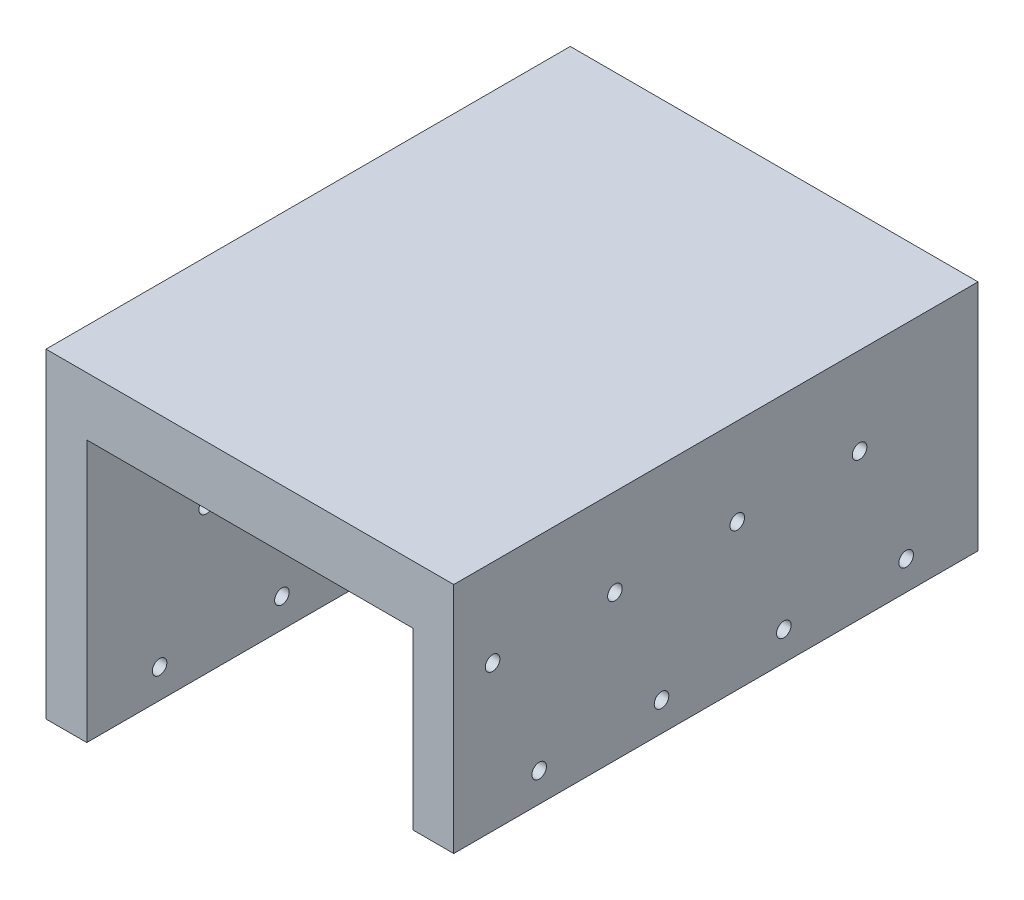
ISO-10303-21;
HEADER;
FILE_DESCRIPTION(('STEP AP214'),'2;1');
FILE_NAME('part.step','',(''),(''),'','','');
FILE_SCHEMA(('AUTOMOTIVE_DESIGN { 1 0 10303 214 1 1 1 1 }'));
ENDSEC;
DATA;
#1=APPLICATION_CONTEXT('core data for automotive mechanical design processes');
#2=APPLICATION_PROTOCOL_DEFINITION('international standard','automotive_design',2000,#1);
#3=PRODUCT_CONTEXT('',#1,'mechanical');
#4=PRODUCT('Part','Part','',(#3));
#5=PRODUCT_RELATED_PRODUCT_CATEGORY('part','',(#4));
#6=PRODUCT_DEFINITION_FORMATION('','',#4);
#7=PRODUCT_DEFINITION_CONTEXT('part definition',#1,'design');
#8=PRODUCT_DEFINITION('design','',#6,#7);
#9=PRODUCT_DEFINITION_SHAPE('','',#8);
#10=(LENGTH_UNIT() NAMED_UNIT(*) SI_UNIT(.MILLI.,.METRE.));
#11=(NAMED_UNIT(*) PLANE_ANGLE_UNIT() SI_UNIT($,.RADIAN.));
#12=(NAMED_UNIT(*) SI_UNIT($,.STERADIAN.) SOLID_ANGLE_UNIT());
#13=UNCERTAINTY_MEASURE_WITH_UNIT(LENGTH_MEASURE(1.E-05),#10,'distance_accuracy_value','');
#14=(GEOMETRIC_REPRESENTATION_CONTEXT(3) GLOBAL_UNCERTAINTY_ASSIGNED_CONTEXT((#13)) GLOBAL_UNIT_ASSIGNED_CONTEXT((#10,
#11,#12)) REPRESENTATION_CONTEXT('',''));
#15=CARTESIAN_POINT('',(0.,0.,0.));
#16=DIRECTION('',(0.,0.,1.));
#17=DIRECTION('',(1.,0.,0.));
#18=AXIS2_PLACEMENT_3D('',#15,#16,#17);
#19=CARTESIAN_POINT('',(0.,0.,90.));
#20=DIRECTION('',(1.,0.,0.));
#21=DIRECTION('',(0.,1.,0.));
#22=AXIS2_PLACEMENT_3D('',#19,#20,#21);
#23=PLANE('',#22);
#24=CARTESIAN_POINT('',(0.,25.,6.50000000000001));
#25=DIRECTION('',(-1.,0.,0.));
#26=DIRECTION('',(0.,-1.,0.));
#27=AXIS2_PLACEMENT_3D('',#24,#25,#26);
#28=CIRCLE('',#27,1.25);
#29=CARTESIAN_POINT('',(0.,23.75,6.50000000000001));
#30=VERTEX_POINT('',#29);
#31=EDGE_CURVE('E269',#30,#30,#28,.T.);
#32=ORIENTED_EDGE('',*,*,#31,.F.);
#33=EDGE_LOOP('',(#32));
#34=FACE_BOUND('',#33,.T.);
#35=CARTESIAN_POINT('',(0.,5.,14.5));
#36=DIRECTION('',(-1.,0.,0.));
#37=DIRECTION('',(0.,-1.,0.));
#38=AXIS2_PLACEMENT_3D('',#35,#36,#37);
#39=CIRCLE('',#38,1.25);
#40=CARTESIAN_POINT('',(0.,3.75,14.5));
#41=VERTEX_POINT('',#40);
#42=EDGE_CURVE('E265',#41,#41,#39,.T.);
#43=ORIENTED_EDGE('',*,*,#42,.F.);
#44=EDGE_LOOP('',(#43));
#45=FACE_BOUND('',#44,.T.);
#46=CARTESIAN_POINT('',(0.,25.,27.5));
#47=DIRECTION('',(-1.,0.,0.));
#48=DIRECTION('',(0.,-1.,0.));
#49=AXIS2_PLACEMENT_3D('',#46,#47,#48);
#50=CIRCLE('',#49,1.25);
#51=CARTESIAN_POINT('',(0.,23.75,27.5));
#52=VERTEX_POINT('',#51);
#53=EDGE_CURVE('E257',#52,#52,#50,.T.);
#54=ORIENTED_EDGE('',*,*,#53,.F.);
#55=EDGE_LOOP('',(#54));
#56=FACE_BOUND('',#55,.T.);
#57=CARTESIAN_POINT('',(0.,5.,35.5));
#58=DIRECTION('',(-1.,0.,0.));
#59=DIRECTION('',(0.,-1.,0.));
#60=AXIS2_PLACEMENT_3D('',#57,#58,#59);
#61=CIRCLE('',#60,1.25000000000001);
#62=CARTESIAN_POINT('',(0.,3.74999999999999,35.5));
#63=VERTEX_POINT('',#62);
#64=EDGE_CURVE('E249',#63,#63,#61,.T.);
#65=ORIENTED_EDGE('',*,*,#64,.F.);
#66=EDGE_LOOP('',(#65));
#67=FACE_BOUND('',#66,.T.);
#68=CARTESIAN_POINT('',(0.,25.,48.5));
#69=DIRECTION('',(-1.,0.,0.));
#70=DIRECTION('',(0.,-1.,0.));
#71=AXIS2_PLACEMENT_3D('',#68,#69,#70);
#72=CIRCLE('',#71,1.25);
#73=CARTESIAN_POINT('',(0.,23.75,48.5));
#74=VERTEX_POINT('',#73);
#75=EDGE_CURVE('E241',#74,#74,#72,.T.);
#76=ORIENTED_EDGE('',*,*,#75,.F.);
#77=EDGE_LOOP('',(#76));
#78=FACE_BOUND('',#77,.T.);
#79=CARTESIAN_POINT('',(0.,5.,56.5));
#80=DIRECTION('',(-1.,0.,0.));
#81=DIRECTION('',(0.,-1.,0.));
#82=AXIS2_PLACEMENT_3D('',#79,#80,#81);
#83=CIRCLE('',#82,1.25000000000001);
#84=CARTESIAN_POINT('',(0.,3.74999999999999,56.5));
#85=VERTEX_POINT('',#84);
#86=EDGE_CURVE('E233',#85,#85,#83,.T.);
#87=ORIENTED_EDGE('',*,*,#86,.F.);
#88=EDGE_LOOP('',(#87));
#89=FACE_BOUND('',#88,.T.);
#90=CARTESIAN_POINT('',(0.,25.,69.5));
#91=DIRECTION('',(-1.,0.,0.));
#92=DIRECTION('',(0.,-1.,0.));
#93=AXIS2_PLACEMENT_3D('',#90,#91,#92);
#94=CIRCLE('',#93,1.25);
#95=CARTESIAN_POINT('',(0.,23.75,69.5));
#96=VERTEX_POINT('',#95);
#97=EDGE_CURVE('E225',#96,#96,#94,.T.);
#98=ORIENTED_EDGE('',*,*,#97,.F.);
#99=EDGE_LOOP('',(#98));
#100=FACE_BOUND('',#99,.T.);
#101=CARTESIAN_POINT('',(0.,5.,77.5));
#102=DIRECTION('',(-1.,0.,0.));
#103=DIRECTION('',(0.,-1.,0.));
#104=AXIS2_PLACEMENT_3D('',#101,#102,#103);
#105=CIRCLE('',#104,1.25000000000001);
#106=CARTESIAN_POINT('',(0.,3.74999999999999,77.5));
#107=VERTEX_POINT('',#106);
#108=EDGE_CURVE('E215',#107,#107,#105,.T.);
#109=ORIENTED_EDGE('',*,*,#108,.F.);
#110=EDGE_LOOP('',(#109));
#111=FACE_BOUND('',#110,.T.);
#112=DIRECTION('',(0.,-1.,0.));
#113=VECTOR('',#112,1.);
#114=CARTESIAN_POINT('',(0.,0.,0.));
#115=LINE('',#114,#113);
#116=CARTESIAN_POINT('',(0.,55.,0.));
#117=VERTEX_POINT('',#116);
#118=CARTESIAN_POINT('',(0.,0.,0.));
#119=VERTEX_POINT('',#118);
#120=EDGE_CURVE('E149',#117,#119,#115,.T.);
#121=ORIENTED_EDGE('',*,*,#120,.T.);
#122=DIRECTION('',(0.,0.,-1.));
#123=VECTOR('',#122,1.);
#124=CARTESIAN_POINT('',(0.,0.,90.));
#125=LINE('',#124,#123);
#126=CARTESIAN_POINT('',(0.,0.,90.));
#127=VERTEX_POINT('',#126);
#128=EDGE_CURVE('E11',#127,#119,#125,.T.);
#129=ORIENTED_EDGE('',*,*,#128,.F.);
#130=DIRECTION('',(0.,-1.,0.));
#131=VECTOR('',#130,1.);
#132=CARTESIAN_POINT('',(0.,0.,90.));
#133=LINE('',#132,#131);
#134=CARTESIAN_POINT('',(0.,55.,90.));
#135=VERTEX_POINT('',#134);
#136=EDGE_CURVE('E146',#135,#127,#133,.T.);
#137=ORIENTED_EDGE('',*,*,#136,.F.);
#138=DIRECTION('',(0.,0.,-1.));
#139=VECTOR('',#138,1.);
#140=CARTESIAN_POINT('',(0.,55.,90.));
#141=LINE('',#140,#139);
#142=EDGE_CURVE('E153',#135,#117,#141,.T.);
#143=ORIENTED_EDGE('',*,*,#142,.T.);
#144=EDGE_LOOP('',(#121,#129,#137,#143));
#145=FACE_BOUND('',#144,.T.);
#146=ADVANCED_FACE('F43',(#34,#45,#56,#67,#78,#89,#100,#111,#145),#23,.F.);
#147=CARTESIAN_POINT('',(0.,0.,90.));
#148=DIRECTION('',(0.,1.,0.));
#149=DIRECTION('',(0.,0.,1.));
#150=AXIS2_PLACEMENT_3D('',#147,#148,#149);
#151=PLANE('',#150);
#152=DIRECTION('',(1.,0.,0.));
#153=VECTOR('',#152,1.);
#154=CARTESIAN_POINT('',(0.,0.,0.));
#155=LINE('',#154,#153);
#156=CARTESIAN_POINT('',(6.99999999999997,0.,0.));
#157=VERTEX_POINT('',#156);
#158=EDGE_CURVE('E142',#119,#157,#155,.T.);
#159=ORIENTED_EDGE('',*,*,#158,.T.);
#160=DIRECTION('',(0.,0.,1.));
#161=VECTOR('',#160,1.);
#162=CARTESIAN_POINT('',(6.99999999999997,0.,0.));
#163=LINE('',#162,#161);
#164=CARTESIAN_POINT('',(6.99999999999997,0.,90.));
#165=VERTEX_POINT('',#164);
#166=EDGE_CURVE('E182',#157,#165,#163,.T.);
#167=ORIENTED_EDGE('',*,*,#166,.T.);
#168=DIRECTION('',(1.,0.,0.));
#169=VECTOR('',#168,1.);
#170=CARTESIAN_POINT('',(0.,0.,90.));
#171=LINE('',#170,#169);
#172=EDGE_CURVE('E90',#127,#165,#171,.T.);
#173=ORIENTED_EDGE('',*,*,#172,.F.);
#174=ORIENTED_EDGE('',*,*,#128,.T.);
#175=EDGE_LOOP('',(#159,#167,#173,#174));
#176=FACE_BOUND('',#175,.T.);
#177=ADVANCED_FACE('F181',(#176),#151,.F.);
#178=CARTESIAN_POINT('',(70.,0.,90.));
#179=DIRECTION('',(-1.,0.,0.));
#180=DIRECTION('',(0.,-1.,0.));
#181=AXIS2_PLACEMENT_3D('',#178,#179,#180);
#182=PLANE('',#181);
#183=CARTESIAN_POINT('',(70.,40.,83.3317645611481));
#184=DIRECTION('',(1.,0.,0.));
#185=DIRECTION('',(0.,1.,0.));
#186=AXIS2_PLACEMENT_3D('',#183,#184,#185);
#187=CIRCLE('',#186,1.25);
#188=CARTESIAN_POINT('',(70.,41.25,83.3317645611481));
#189=VERTEX_POINT('',#188);
#190=EDGE_CURVE('E332',#189,#189,#187,.T.);
#191=ORIENTED_EDGE('',*,*,#190,.F.);
#192=EDGE_LOOP('',(#191));
#193=FACE_BOUND('',#192,.T.);
#194=CARTESIAN_POINT('',(70.,20.,75.3317645611481));
#195=DIRECTION('',(1.,0.,0.));
#196=DIRECTION('',(0.,1.,0.));
#197=AXIS2_PLACEMENT_3D('',#194,#195,#196);
#198=CIRCLE('',#197,1.25);
#199=CARTESIAN_POINT('',(70.,21.25,75.3317645611481));
#200=VERTEX_POINT('',#199);
#201=EDGE_CURVE('E328',#200,#200,#198,.T.);
#202=ORIENTED_EDGE('',*,*,#201,.F.);
#203=EDGE_LOOP('',(#202));
#204=FACE_BOUND('',#203,.T.);
#205=CARTESIAN_POINT('',(70.,40.,62.3317645611481));
#206=DIRECTION('',(1.,0.,0.));
#207=DIRECTION('',(0.,1.,0.));
#208=AXIS2_PLACEMENT_3D('',#205,#206,#207);
#209=CIRCLE('',#208,1.25);
#210=CARTESIAN_POINT('',(70.,41.25,62.3317645611481));
#211=VERTEX_POINT('',#210);
#212=EDGE_CURVE('E320',#211,#211,#209,.T.);
#213=ORIENTED_EDGE('',*,*,#212,.F.);
#214=EDGE_LOOP('',(#213));
#215=FACE_BOUND('',#214,.T.);
#216=CARTESIAN_POINT('',(70.,20.,54.3317645611481));
#217=DIRECTION('',(1.,0.,0.));
#218=DIRECTION('',(0.,1.,0.));
#219=AXIS2_PLACEMENT_3D('',#216,#217,#218);
#220=CIRCLE('',#219,1.25000000000001);
#221=CARTESIAN_POINT('',(70.,21.25,54.3317645611481));
#222=VERTEX_POINT('',#221);
#223=EDGE_CURVE('E312',#222,#222,#220,.T.);
#224=ORIENTED_EDGE('',*,*,#223,.F.);
#225=EDGE_LOOP('',(#224));
#226=FACE_BOUND('',#225,.T.);
#227=CARTESIAN_POINT('',(70.,40.,41.3317645611481));
#228=DIRECTION('',(1.,0.,0.));
#229=DIRECTION('',(0.,1.,0.));
#230=AXIS2_PLACEMENT_3D('',#227,#228,#229);
#231=CIRCLE('',#230,1.25);
#232=CARTESIAN_POINT('',(70.,41.25,41.3317645611481));
#233=VERTEX_POINT('',#232);
#234=EDGE_CURVE('E304',#233,#233,#231,.T.);
#235=ORIENTED_EDGE('',*,*,#234,.F.);
#236=EDGE_LOOP('',(#235));
#237=FACE_BOUND('',#236,.T.);
#238=CARTESIAN_POINT('',(70.,20.,33.3317645611481));
#239=DIRECTION('',(1.,0.,0.));
#240=DIRECTION('',(0.,1.,0.));
#241=AXIS2_PLACEMENT_3D('',#238,#239,#240);
#242=CIRCLE('',#241,1.25000000000001);
#243=CARTESIAN_POINT('',(70.,21.25,33.3317645611481));
#244=VERTEX_POINT('',#243);
#245=EDGE_CURVE('E296',#244,#244,#242,.T.);
#246=ORIENTED_EDGE('',*,*,#245,.F.);
#247=EDGE_LOOP('',(#246));
#248=FACE_BOUND('',#247,.T.);
#249=CARTESIAN_POINT('',(70.,40.,20.3317645611481));
#250=DIRECTION('',(1.,0.,0.));
#251=DIRECTION('',(0.,1.,0.));
#252=AXIS2_PLACEMENT_3D('',#249,#250,#251);
#253=CIRCLE('',#252,1.25);
#254=CARTESIAN_POINT('',(70.,41.25,20.3317645611481));
#255=VERTEX_POINT('',#254);
#256=EDGE_CURVE('E288',#255,#255,#253,.T.);
#257=ORIENTED_EDGE('',*,*,#256,.F.);
#258=EDGE_LOOP('',(#257));
#259=FACE_BOUND('',#258,.T.);
#260=CARTESIAN_POINT('',(70.,20.,12.3317645611481));
#261=DIRECTION('',(1.,0.,0.));
#262=DIRECTION('',(0.,1.,0.));
#263=AXIS2_PLACEMENT_3D('',#260,#261,#262);
#264=CIRCLE('',#263,1.25000000000001);
#265=CARTESIAN_POINT('',(70.,21.25,12.3317645611481));
#266=VERTEX_POINT('',#265);
#267=EDGE_CURVE('E279',#266,#266,#264,.T.);
#268=ORIENTED_EDGE('',*,*,#267,.F.);
#269=EDGE_LOOP('',(#268));
#270=FACE_BOUND('',#269,.T.);
#271=DIRECTION('',(0.,1.,0.));
#272=VECTOR('',#271,1.);
#273=CARTESIAN_POINT('',(70.,0.,90.));
#274=LINE('',#273,#272);
#275=CARTESIAN_POINT('',(70.,15.,90.));
#276=VERTEX_POINT('',#275);
#277=CARTESIAN_POINT('',(70.,55.,90.));
#278=VERTEX_POINT('',#277);
#279=EDGE_CURVE('E134',#276,#278,#274,.T.);
#280=ORIENTED_EDGE('',*,*,#279,.F.);
#281=DIRECTION('',(0.,0.,1.));
#282=VECTOR('',#281,1.);
#283=CARTESIAN_POINT('',(70.,15.,0.));
#284=LINE('',#283,#282);
#285=CARTESIAN_POINT('',(70.,15.,0.));
#286=VERTEX_POINT('',#285);
#287=EDGE_CURVE('E121',#286,#276,#284,.T.);
#288=ORIENTED_EDGE('',*,*,#287,.F.);
#289=DIRECTION('',(0.,1.,0.));
#290=VECTOR('',#289,1.);
#291=CARTESIAN_POINT('',(70.,0.,0.));
#292=LINE('',#291,#290);
#293=CARTESIAN_POINT('',(70.,55.,0.));
#294=VERTEX_POINT('',#293);
#295=EDGE_CURVE('E133',#286,#294,#292,.T.);
#296=ORIENTED_EDGE('',*,*,#295,.T.);
#297=DIRECTION('',(0.,0.,-1.));
#298=VECTOR('',#297,1.);
#299=CARTESIAN_POINT('',(70.,55.,90.));
#300=LINE('',#299,#298);
#301=EDGE_CURVE('E51',#278,#294,#300,.T.);
#302=ORIENTED_EDGE('',*,*,#301,.F.);
#303=EDGE_LOOP('',(#280,#288,#296,#302));
#304=FACE_BOUND('',#303,.T.);
#305=ADVANCED_FACE('F131',(#193,#204,#215,#226,#237,#248,#259,#270,#304),#182,.F.);
#306=CARTESIAN_POINT('',(0.,55.,90.));
#307=DIRECTION('',(0.,-1.,0.));
#308=DIRECTION('',(0.,0.,-1.));
#309=AXIS2_PLACEMENT_3D('',#306,#307,#308);
#310=PLANE('',#309);
#311=DIRECTION('',(-1.,0.,0.));
#312=VECTOR('',#311,1.);
#313=CARTESIAN_POINT('',(0.,55.,0.));
#314=LINE('',#313,#312);
#315=EDGE_CURVE('E84',#294,#117,#314,.T.);
#316=ORIENTED_EDGE('',*,*,#315,.T.);
#317=ORIENTED_EDGE('',*,*,#142,.F.);
#318=DIRECTION('',(-1.,0.,0.));
#319=VECTOR('',#318,1.);
#320=CARTESIAN_POINT('',(0.,55.,90.));
#321=LINE('',#320,#319);
#322=EDGE_CURVE('E67',#278,#135,#321,.T.);
#323=ORIENTED_EDGE('',*,*,#322,.F.);
#324=ORIENTED_EDGE('',*,*,#301,.T.);
#325=EDGE_LOOP('',(#316,#317,#323,#324));
#326=FACE_BOUND('',#325,.T.);
#327=ADVANCED_FACE('F156',(#326),#310,.F.);
#328=CARTESIAN_POINT('',(0.,0.,90.));
#329=DIRECTION('',(0.,0.,-1.));
#330=DIRECTION('',(-1.,0.,0.));
#331=AXIS2_PLACEMENT_3D('',#328,#329,#330);
#332=PLANE('',#331);
#333=ORIENTED_EDGE('',*,*,#172,.T.);
#334=DIRECTION('',(0.,1.,0.));
#335=VECTOR('',#334,1.);
#336=CARTESIAN_POINT('',(6.99999999999997,0.,90.));
#337=LINE('',#336,#335);
#338=CARTESIAN_POINT('',(6.99999999999997,45.,90.));
#339=VERTEX_POINT('',#338);
#340=EDGE_CURVE('E165',#165,#339,#337,.T.);
#341=ORIENTED_EDGE('',*,*,#340,.T.);
#342=DIRECTION('',(1.,0.,0.));
#343=VECTOR('',#342,1.);
#344=CARTESIAN_POINT('',(0.,45.,90.));
#345=LINE('',#344,#343);
#346=CARTESIAN_POINT('',(63.,45.,90.));
#347=VERTEX_POINT('',#346);
#348=EDGE_CURVE('E170',#339,#347,#345,.T.);
#349=ORIENTED_EDGE('',*,*,#348,.T.);
#350=DIRECTION('',(0.,-1.,0.));
#351=VECTOR('',#350,1.);
#352=CARTESIAN_POINT('',(63.,0.,90.));
#353=LINE('',#352,#351);
#354=CARTESIAN_POINT('',(63.,15.,90.));
#355=VERTEX_POINT('',#354);
#356=EDGE_CURVE('E174',#347,#355,#353,.T.);
#357=ORIENTED_EDGE('',*,*,#356,.T.);
#358=DIRECTION('',(1.,0.,0.));
#359=VECTOR('',#358,1.);
#360=CARTESIAN_POINT('',(0.,15.,90.));
#361=LINE('',#360,#359);
#362=EDGE_CURVE('E197',#355,#276,#361,.T.);
#363=ORIENTED_EDGE('',*,*,#362,.T.);
#364=ORIENTED_EDGE('',*,*,#279,.T.);
#365=ORIENTED_EDGE('',*,*,#322,.T.);
#366=ORIENTED_EDGE('',*,*,#136,.T.);
#367=EDGE_LOOP('',(#333,#341,#349,#357,#363,#364,#365,#366));
#368=FACE_BOUND('',#367,.T.);
#369=ADVANCED_FACE('F180',(#368),#332,.F.);
#370=CARTESIAN_POINT('',(0.,0.,0.));
#371=DIRECTION('',(0.,0.,-1.));
#372=DIRECTION('',(-1.,0.,0.));
#373=AXIS2_PLACEMENT_3D('',#370,#371,#372);
#374=PLANE('',#373);
#375=DIRECTION('',(0.,-1.,0.));
#376=VECTOR('',#375,1.);
#377=CARTESIAN_POINT('',(6.99999999999997,0.,0.));
#378=LINE('',#377,#376);
#379=CARTESIAN_POINT('',(6.99999999999997,45.,0.));
#380=VERTEX_POINT('',#379);
#381=EDGE_CURVE('E136',#380,#157,#378,.T.);
#382=ORIENTED_EDGE('',*,*,#381,.T.);
#383=ORIENTED_EDGE('',*,*,#158,.F.);
#384=ORIENTED_EDGE('',*,*,#120,.F.);
#385=ORIENTED_EDGE('',*,*,#315,.F.);
#386=ORIENTED_EDGE('',*,*,#295,.F.);
#387=DIRECTION('',(-1.,0.,0.));
#388=VECTOR('',#387,1.);
#389=CARTESIAN_POINT('',(63.,15.,0.));
#390=LINE('',#389,#388);
#391=CARTESIAN_POINT('',(63.,15.,0.));
#392=VERTEX_POINT('',#391);
#393=EDGE_CURVE('E118',#286,#392,#390,.T.);
#394=ORIENTED_EDGE('',*,*,#393,.T.);
#395=DIRECTION('',(0.,1.,0.));
#396=VECTOR('',#395,1.);
#397=CARTESIAN_POINT('',(63.,45.,0.));
#398=LINE('',#397,#396);
#399=CARTESIAN_POINT('',(63.,45.,0.));
#400=VERTEX_POINT('',#399);
#401=EDGE_CURVE('E58',#392,#400,#398,.T.);
#402=ORIENTED_EDGE('',*,*,#401,.T.);
#403=DIRECTION('',(-1.,0.,0.));
#404=VECTOR('',#403,1.);
#405=CARTESIAN_POINT('',(6.99999999999997,45.,0.));
#406=LINE('',#405,#404);
#407=EDGE_CURVE('E186',#400,#380,#406,.T.);
#408=ORIENTED_EDGE('',*,*,#407,.T.);
#409=EDGE_LOOP('',(#382,#383,#384,#385,#386,#394,#402,#408));
#410=FACE_BOUND('',#409,.T.);
#411=ADVANCED_FACE('F139',(#410),#374,.T.);
#412=CARTESIAN_POINT('',(6.99999999999997,0.,0.));
#413=DIRECTION('',(-1.,0.,0.));
#414=DIRECTION('',(0.,0.,1.));
#415=AXIS2_PLACEMENT_3D('',#412,#413,#414);
#416=PLANE('',#415);
#417=CARTESIAN_POINT('',(6.99999999999997,25.,6.50000000000001));
#418=DIRECTION('',(-1.,0.,0.));
#419=DIRECTION('',(0.,0.,1.));
#420=AXIS2_PLACEMENT_3D('',#417,#418,#419);
#421=CIRCLE('',#420,1.25);
#422=CARTESIAN_POINT('',(6.99999999999997,25.,7.75000000000001));
#423=VERTEX_POINT('',#422);
#424=EDGE_CURVE('E127',#423,#423,#421,.F.);
#425=ORIENTED_EDGE('',*,*,#424,.F.);
#426=EDGE_LOOP('',(#425));
#427=FACE_BOUND('',#426,.T.);
#428=CARTESIAN_POINT('',(6.99999999999997,5.,14.5));
#429=DIRECTION('',(-1.,0.,0.));
#430=DIRECTION('',(0.,0.,1.));
#431=AXIS2_PLACEMENT_3D('',#428,#429,#430);
#432=CIRCLE('',#431,1.25);
#433=CARTESIAN_POINT('',(6.99999999999997,5.,15.75));
#434=VERTEX_POINT('',#433);
#435=EDGE_CURVE('E261',#434,#434,#432,.F.);
#436=ORIENTED_EDGE('',*,*,#435,.F.);
#437=EDGE_LOOP('',(#436));
#438=FACE_BOUND('',#437,.T.);
#439=CARTESIAN_POINT('',(6.99999999999997,25.,27.5));
#440=DIRECTION('',(-1.,0.,0.));
#441=DIRECTION('',(0.,0.,1.));
#442=AXIS2_PLACEMENT_3D('',#439,#440,#441);
#443=CIRCLE('',#442,1.25);
#444=CARTESIAN_POINT('',(6.99999999999997,25.,28.75));
#445=VERTEX_POINT('',#444);
#446=EDGE_CURVE('E253',#445,#445,#443,.F.);
#447=ORIENTED_EDGE('',*,*,#446,.F.);
#448=EDGE_LOOP('',(#447));
#449=FACE_BOUND('',#448,.T.);
#450=CARTESIAN_POINT('',(6.99999999999997,5.,35.5));
#451=DIRECTION('',(-1.,0.,0.));
#452=DIRECTION('',(0.,0.,1.));
#453=AXIS2_PLACEMENT_3D('',#450,#451,#452);
#454=CIRCLE('',#453,1.25000000000001);
#455=CARTESIAN_POINT('',(6.99999999999997,5.,36.75));
#456=VERTEX_POINT('',#455);
#457=EDGE_CURVE('E245',#456,#456,#454,.F.);
#458=ORIENTED_EDGE('',*,*,#457,.F.);
#459=EDGE_LOOP('',(#458));
#460=FACE_BOUND('',#459,.T.);
#461=CARTESIAN_POINT('',(6.99999999999997,25.,48.5));
#462=DIRECTION('',(-1.,0.,0.));
#463=DIRECTION('',(0.,0.,1.));
#464=AXIS2_PLACEMENT_3D('',#461,#462,#463);
#465=CIRCLE('',#464,1.25);
#466=CARTESIAN_POINT('',(6.99999999999997,25.,49.75));
#467=VERTEX_POINT('',#466);
#468=EDGE_CURVE('E237',#467,#467,#465,.F.);
#469=ORIENTED_EDGE('',*,*,#468,.F.);
#470=EDGE_LOOP('',(#469));
#471=FACE_BOUND('',#470,.T.);
#472=CARTESIAN_POINT('',(6.99999999999997,5.,56.5));
#473=DIRECTION('',(-1.,0.,0.));
#474=DIRECTION('',(0.,0.,1.));
#475=AXIS2_PLACEMENT_3D('',#472,#473,#474);
#476=CIRCLE('',#475,1.25000000000001);
#477=CARTESIAN_POINT('',(6.99999999999997,5.,57.75));
#478=VERTEX_POINT('',#477);
#479=EDGE_CURVE('E229',#478,#478,#476,.F.);
#480=ORIENTED_EDGE('',*,*,#479,.F.);
#481=EDGE_LOOP('',(#480));
#482=FACE_BOUND('',#481,.T.);
#483=CARTESIAN_POINT('',(6.99999999999997,25.,69.5));
#484=DIRECTION('',(-1.,0.,0.));
#485=DIRECTION('',(0.,0.,1.));
#486=AXIS2_PLACEMENT_3D('',#483,#484,#485);
#487=CIRCLE('',#486,1.25);
#488=CARTESIAN_POINT('',(6.99999999999997,25.,70.75));
#489=VERTEX_POINT('',#488);
#490=EDGE_CURVE('E219',#489,#489,#487,.F.);
#491=ORIENTED_EDGE('',*,*,#490,.F.);
#492=EDGE_LOOP('',(#491));
#493=FACE_BOUND('',#492,.T.);
#494=CARTESIAN_POINT('',(6.99999999999997,5.,77.5));
#495=DIRECTION('',(-1.,0.,0.));
#496=DIRECTION('',(0.,0.,1.));
#497=AXIS2_PLACEMENT_3D('',#494,#495,#496);
#498=CIRCLE('',#497,1.25000000000001);
#499=CARTESIAN_POINT('',(6.99999999999997,5.,78.75));
#500=VERTEX_POINT('',#499);
#501=EDGE_CURVE('E220',#500,#500,#498,.F.);
#502=ORIENTED_EDGE('',*,*,#501,.F.);
#503=EDGE_LOOP('',(#502));
#504=FACE_BOUND('',#503,.T.);
#505=ORIENTED_EDGE('',*,*,#166,.F.);
#506=ORIENTED_EDGE('',*,*,#381,.F.);
#507=DIRECTION('',(0.,0.,1.));
#508=VECTOR('',#507,1.);
#509=CARTESIAN_POINT('',(6.99999999999997,45.,0.));
#510=LINE('',#509,#508);
#511=EDGE_CURVE('E198',#380,#339,#510,.T.);
#512=ORIENTED_EDGE('',*,*,#511,.T.);
#513=ORIENTED_EDGE('',*,*,#340,.F.);
#514=EDGE_LOOP('',(#505,#506,#512,#513));
#515=FACE_BOUND('',#514,.T.);
#516=ADVANCED_FACE('F414',(#427,#438,#449,#460,#471,#482,#493,#504,#515),#416,.F.);
#517=CARTESIAN_POINT('',(6.99999999999997,45.,0.));
#518=DIRECTION('',(0.,1.,0.));
#519=DIRECTION('',(0.,0.,1.));
#520=AXIS2_PLACEMENT_3D('',#517,#518,#519);
#521=PLANE('',#520);
#522=ORIENTED_EDGE('',*,*,#511,.F.);
#523=ORIENTED_EDGE('',*,*,#407,.F.);
#524=DIRECTION('',(0.,0.,1.));
#525=VECTOR('',#524,1.);
#526=CARTESIAN_POINT('',(63.,45.,0.));
#527=LINE('',#526,#525);
#528=EDGE_CURVE('E201',#400,#347,#527,.T.);
#529=ORIENTED_EDGE('',*,*,#528,.T.);
#530=ORIENTED_EDGE('',*,*,#348,.F.);
#531=EDGE_LOOP('',(#522,#523,#529,#530));
#532=FACE_BOUND('',#531,.T.);
#533=ADVANCED_FACE('F212',(#532),#521,.F.);
#534=CARTESIAN_POINT('',(63.,45.,0.));
#535=DIRECTION('',(1.,0.,0.));
#536=DIRECTION('',(0.,0.,-1.));
#537=AXIS2_PLACEMENT_3D('',#534,#535,#536);
#538=PLANE('',#537);
#539=CARTESIAN_POINT('',(63.,40.,83.3317645611481));
#540=DIRECTION('',(1.,0.,0.));
#541=DIRECTION('',(0.,0.,-1.));
#542=AXIS2_PLACEMENT_3D('',#539,#540,#541);
#543=CIRCLE('',#542,1.25);
#544=CARTESIAN_POINT('',(63.,40.,82.0817645611481));
#545=VERTEX_POINT('',#544);
#546=EDGE_CURVE('E224',#545,#545,#543,.F.);
#547=ORIENTED_EDGE('',*,*,#546,.F.);
#548=EDGE_LOOP('',(#547));
#549=FACE_BOUND('',#548,.T.);
#550=CARTESIAN_POINT('',(63.,20.,75.3317645611481));
#551=DIRECTION('',(1.,0.,0.));
#552=DIRECTION('',(0.,0.,-1.));
#553=AXIS2_PLACEMENT_3D('',#550,#551,#552);
#554=CIRCLE('',#553,1.25);
#555=CARTESIAN_POINT('',(63.,20.,74.0817645611481));
#556=VERTEX_POINT('',#555);
#557=EDGE_CURVE('E324',#556,#556,#554,.F.);
#558=ORIENTED_EDGE('',*,*,#557,.F.);
#559=EDGE_LOOP('',(#558));
#560=FACE_BOUND('',#559,.T.);
#561=CARTESIAN_POINT('',(63.,40.,62.3317645611481));
#562=DIRECTION('',(1.,0.,0.));
#563=DIRECTION('',(0.,0.,-1.));
#564=AXIS2_PLACEMENT_3D('',#561,#562,#563);
#565=CIRCLE('',#564,1.25);
#566=CARTESIAN_POINT('',(63.,40.,61.0817645611481));
#567=VERTEX_POINT('',#566);
#568=EDGE_CURVE('E316',#567,#567,#565,.F.);
#569=ORIENTED_EDGE('',*,*,#568,.F.);
#570=EDGE_LOOP('',(#569));
#571=FACE_BOUND('',#570,.T.);
#572=CARTESIAN_POINT('',(63.,20.,54.3317645611481));
#573=DIRECTION('',(1.,0.,0.));
#574=DIRECTION('',(0.,0.,-1.));
#575=AXIS2_PLACEMENT_3D('',#572,#573,#574);
#576=CIRCLE('',#575,1.25000000000001);
#577=CARTESIAN_POINT('',(63.,20.,53.0817645611481));
#578=VERTEX_POINT('',#577);
#579=EDGE_CURVE('E308',#578,#578,#576,.F.);
#580=ORIENTED_EDGE('',*,*,#579,.F.);
#581=EDGE_LOOP('',(#580));
#582=FACE_BOUND('',#581,.T.);
#583=CARTESIAN_POINT('',(63.,40.,41.3317645611481));
#584=DIRECTION('',(1.,0.,0.));
#585=DIRECTION('',(0.,0.,-1.));
#586=AXIS2_PLACEMENT_3D('',#583,#584,#585);
#587=CIRCLE('',#586,1.25);
#588=CARTESIAN_POINT('',(63.,40.,40.0817645611481));
#589=VERTEX_POINT('',#588);
#590=EDGE_CURVE('E300',#589,#589,#587,.F.);
#591=ORIENTED_EDGE('',*,*,#590,.F.);
#592=EDGE_LOOP('',(#591));
#593=FACE_BOUND('',#592,.T.);
#594=CARTESIAN_POINT('',(63.,20.,33.3317645611481));
#595=DIRECTION('',(1.,0.,0.));
#596=DIRECTION('',(0.,0.,-1.));
#597=AXIS2_PLACEMENT_3D('',#594,#595,#596);
#598=CIRCLE('',#597,1.25000000000001);
#599=CARTESIAN_POINT('',(63.,20.,32.0817645611481));
#600=VERTEX_POINT('',#599);
#601=EDGE_CURVE('E292',#600,#600,#598,.F.);
#602=ORIENTED_EDGE('',*,*,#601,.F.);
#603=EDGE_LOOP('',(#602));
#604=FACE_BOUND('',#603,.T.);
#605=CARTESIAN_POINT('',(63.,40.,20.3317645611481));
#606=DIRECTION('',(1.,0.,0.));
#607=DIRECTION('',(0.,0.,-1.));
#608=AXIS2_PLACEMENT_3D('',#605,#606,#607);
#609=CIRCLE('',#608,1.25);
#610=CARTESIAN_POINT('',(63.,40.,19.0817645611481));
#611=VERTEX_POINT('',#610);
#612=EDGE_CURVE('E283',#611,#611,#609,.F.);
#613=ORIENTED_EDGE('',*,*,#612,.F.);
#614=EDGE_LOOP('',(#613));
#615=FACE_BOUND('',#614,.T.);
#616=CARTESIAN_POINT('',(63.,20.,12.3317645611481));
#617=DIRECTION('',(1.,0.,0.));
#618=DIRECTION('',(0.,0.,-1.));
#619=AXIS2_PLACEMENT_3D('',#616,#617,#618);
#620=CIRCLE('',#619,1.25000000000001);
#621=CARTESIAN_POINT('',(63.,20.,11.0817645611481));
#622=VERTEX_POINT('',#621);
#623=EDGE_CURVE('E284',#622,#622,#620,.F.);
#624=ORIENTED_EDGE('',*,*,#623,.F.);
#625=EDGE_LOOP('',(#624));
#626=FACE_BOUND('',#625,.T.);
#627=ORIENTED_EDGE('',*,*,#528,.F.);
#628=ORIENTED_EDGE('',*,*,#401,.F.);
#629=DIRECTION('',(0.,0.,1.));
#630=VECTOR('',#629,1.);
#631=CARTESIAN_POINT('',(63.,15.,0.));
#632=LINE('',#631,#630);
#633=EDGE_CURVE('E123',#392,#355,#632,.T.);
#634=ORIENTED_EDGE('',*,*,#633,.T.);
#635=ORIENTED_EDGE('',*,*,#356,.F.);
#636=EDGE_LOOP('',(#627,#628,#634,#635));
#637=FACE_BOUND('',#636,.T.);
#638=ADVANCED_FACE('F210',(#549,#560,#571,#582,#593,#604,#615,#626,#637),#538,.F.);
#639=CARTESIAN_POINT('',(63.,15.,0.));
#640=DIRECTION('',(0.,1.,0.));
#641=DIRECTION('',(0.,0.,1.));
#642=AXIS2_PLACEMENT_3D('',#639,#640,#641);
#643=PLANE('',#642);
#644=ORIENTED_EDGE('',*,*,#633,.F.);
#645=ORIENTED_EDGE('',*,*,#393,.F.);
#646=ORIENTED_EDGE('',*,*,#287,.T.);
#647=ORIENTED_EDGE('',*,*,#362,.F.);
#648=EDGE_LOOP('',(#644,#645,#646,#647));
#649=FACE_BOUND('',#648,.T.);
#650=ADVANCED_FACE('F120',(#649),#643,.F.);
#651=CARTESIAN_POINT('',(10.5355339059327,5.00000000000001,77.5));
#652=DIRECTION('',(-1.,0.,0.));
#653=DIRECTION('',(0.,-1.,0.));
#654=AXIS2_PLACEMENT_3D('',#651,#652,#653);
#655=CYLINDRICAL_SURFACE('',#654,1.25000000000001);
#656=ORIENTED_EDGE('',*,*,#501,.T.);
#657=EDGE_LOOP('',(#656));
#658=FACE_BOUND('',#657,.T.);
#659=ORIENTED_EDGE('',*,*,#108,.T.);
#660=EDGE_LOOP('',(#659));
#661=FACE_BOUND('',#660,.T.);
#662=ADVANCED_FACE('F399',(#658,#661),#655,.F.);
#663=CARTESIAN_POINT('',(10.5355339059327,25.,69.5));
#664=DIRECTION('',(-1.,0.,0.));
#665=DIRECTION('',(0.,-1.,0.));
#666=AXIS2_PLACEMENT_3D('',#663,#664,#665);
#667=CYLINDRICAL_SURFACE('',#666,1.25);
#668=ORIENTED_EDGE('',*,*,#490,.T.);
#669=EDGE_LOOP('',(#668));
#670=FACE_BOUND('',#669,.T.);
#671=ORIENTED_EDGE('',*,*,#97,.T.);
#672=EDGE_LOOP('',(#671));
#673=FACE_BOUND('',#672,.T.);
#674=ADVANCED_FACE('F401',(#670,#673),#667,.F.);
#675=CARTESIAN_POINT('',(10.5355339059327,5.00000000000001,56.5));
#676=DIRECTION('',(-1.,0.,0.));
#677=DIRECTION('',(0.,-1.,0.));
#678=AXIS2_PLACEMENT_3D('',#675,#676,#677);
#679=CYLINDRICAL_SURFACE('',#678,1.25000000000001);
#680=ORIENTED_EDGE('',*,*,#479,.T.);
#681=EDGE_LOOP('',(#680));
#682=FACE_BOUND('',#681,.T.);
#683=ORIENTED_EDGE('',*,*,#86,.T.);
#684=EDGE_LOOP('',(#683));
#685=FACE_BOUND('',#684,.T.);
#686=ADVANCED_FACE('F408',(#682,#685),#679,.F.);
#687=CARTESIAN_POINT('',(10.5355339059327,25.,48.5));
#688=DIRECTION('',(-1.,0.,0.));
#689=DIRECTION('',(0.,-1.,0.));
#690=AXIS2_PLACEMENT_3D('',#687,#688,#689);
#691=CYLINDRICAL_SURFACE('',#690,1.25);
#692=ORIENTED_EDGE('',*,*,#468,.T.);
#693=EDGE_LOOP('',(#692));
#694=FACE_BOUND('',#693,.T.);
#695=ORIENTED_EDGE('',*,*,#75,.T.);
#696=EDGE_LOOP('',(#695));
#697=FACE_BOUND('',#696,.T.);
#698=ADVANCED_FACE('F522',(#694,#697),#691,.F.);
#699=CARTESIAN_POINT('',(10.5355339059327,5.00000000000001,35.5));
#700=DIRECTION('',(-1.,0.,0.));
#701=DIRECTION('',(0.,-1.,0.));
#702=AXIS2_PLACEMENT_3D('',#699,#700,#701);
#703=CYLINDRICAL_SURFACE('',#702,1.25000000000001);
#704=ORIENTED_EDGE('',*,*,#457,.T.);
#705=EDGE_LOOP('',(#704));
#706=FACE_BOUND('',#705,.T.);
#707=ORIENTED_EDGE('',*,*,#64,.T.);
#708=EDGE_LOOP('',(#707));
#709=FACE_BOUND('',#708,.T.);
#710=ADVANCED_FACE('F531',(#706,#709),#703,.F.);
#711=CARTESIAN_POINT('',(10.5355339059327,25.,27.5));
#712=DIRECTION('',(-1.,0.,0.));
#713=DIRECTION('',(0.,-1.,0.));
#714=AXIS2_PLACEMENT_3D('',#711,#712,#713);
#715=CYLINDRICAL_SURFACE('',#714,1.25);
#716=ORIENTED_EDGE('',*,*,#446,.T.);
#717=EDGE_LOOP('',(#716));
#718=FACE_BOUND('',#717,.T.);
#719=ORIENTED_EDGE('',*,*,#53,.T.);
#720=EDGE_LOOP('',(#719));
#721=FACE_BOUND('',#720,.T.);
#722=ADVANCED_FACE('F541',(#718,#721),#715,.F.);
#723=CARTESIAN_POINT('',(10.5355339059327,5.00000000000001,14.5));
#724=DIRECTION('',(-1.,0.,0.));
#725=DIRECTION('',(0.,-1.,0.));
#726=AXIS2_PLACEMENT_3D('',#723,#724,#725);
#727=CYLINDRICAL_SURFACE('',#726,1.25);
#728=ORIENTED_EDGE('',*,*,#435,.T.);
#729=EDGE_LOOP('',(#728));
#730=FACE_BOUND('',#729,.T.);
#731=ORIENTED_EDGE('',*,*,#42,.T.);
#732=EDGE_LOOP('',(#731));
#733=FACE_BOUND('',#732,.T.);
#734=ADVANCED_FACE('F375',(#730,#733),#727,.F.);
#735=CARTESIAN_POINT('',(10.5355339059327,25.,6.50000000000001));
#736=DIRECTION('',(-1.,0.,0.));
#737=DIRECTION('',(0.,-1.,0.));
#738=AXIS2_PLACEMENT_3D('',#735,#736,#737);
#739=CYLINDRICAL_SURFACE('',#738,1.25);
#740=ORIENTED_EDGE('',*,*,#424,.T.);
#741=EDGE_LOOP('',(#740));
#742=FACE_BOUND('',#741,.T.);
#743=ORIENTED_EDGE('',*,*,#31,.T.);
#744=EDGE_LOOP('',(#743));
#745=FACE_BOUND('',#744,.T.);
#746=ADVANCED_FACE('F365',(#742,#745),#739,.F.);
#747=CARTESIAN_POINT('',(59.4644660940672,20.,12.3317645611481));
#748=DIRECTION('',(1.,0.,0.));
#749=DIRECTION('',(0.,1.,0.));
#750=AXIS2_PLACEMENT_3D('',#747,#748,#749);
#751=CYLINDRICAL_SURFACE('',#750,1.25000000000001);
#752=ORIENTED_EDGE('',*,*,#623,.T.);
#753=EDGE_LOOP('',(#752));
#754=FACE_BOUND('',#753,.T.);
#755=ORIENTED_EDGE('',*,*,#267,.T.);
#756=EDGE_LOOP('',(#755));
#757=FACE_BOUND('',#756,.T.);
#758=ADVANCED_FACE('F362',(#754,#757),#751,.F.);
#759=CARTESIAN_POINT('',(59.4644660940672,40.,20.3317645611481));
#760=DIRECTION('',(1.,0.,0.));
#761=DIRECTION('',(0.,1.,0.));
#762=AXIS2_PLACEMENT_3D('',#759,#760,#761);
#763=CYLINDRICAL_SURFACE('',#762,1.25);
#764=ORIENTED_EDGE('',*,*,#612,.T.);
#765=EDGE_LOOP('',(#764));
#766=FACE_BOUND('',#765,.T.);
#767=ORIENTED_EDGE('',*,*,#256,.T.);
#768=EDGE_LOOP('',(#767));
#769=FACE_BOUND('',#768,.T.);
#770=ADVANCED_FACE('F364',(#766,#769),#763,.F.);
#771=CARTESIAN_POINT('',(59.4644660940672,20.,33.3317645611481));
#772=DIRECTION('',(1.,0.,0.));
#773=DIRECTION('',(0.,1.,0.));
#774=AXIS2_PLACEMENT_3D('',#771,#772,#773);
#775=CYLINDRICAL_SURFACE('',#774,1.25000000000001);
#776=ORIENTED_EDGE('',*,*,#601,.T.);
#777=EDGE_LOOP('',(#776));
#778=FACE_BOUND('',#777,.T.);
#779=ORIENTED_EDGE('',*,*,#245,.T.);
#780=EDGE_LOOP('',(#779));
#781=FACE_BOUND('',#780,.T.);
#782=ADVANCED_FACE('F372',(#778,#781),#775,.F.);
#783=CARTESIAN_POINT('',(59.4644660940672,40.,41.3317645611481));
#784=DIRECTION('',(1.,0.,0.));
#785=DIRECTION('',(0.,1.,0.));
#786=AXIS2_PLACEMENT_3D('',#783,#784,#785);
#787=CYLINDRICAL_SURFACE('',#786,1.25);
#788=ORIENTED_EDGE('',*,*,#590,.T.);
#789=EDGE_LOOP('',(#788));
#790=FACE_BOUND('',#789,.T.);
#791=ORIENTED_EDGE('',*,*,#234,.T.);
#792=EDGE_LOOP('',(#791));
#793=FACE_BOUND('',#792,.T.);
#794=ADVANCED_FACE('F585',(#790,#793),#787,.F.);
#795=CARTESIAN_POINT('',(59.4644660940672,20.,54.3317645611481));
#796=DIRECTION('',(1.,0.,0.));
#797=DIRECTION('',(0.,1.,0.));
#798=AXIS2_PLACEMENT_3D('',#795,#796,#797);
#799=CYLINDRICAL_SURFACE('',#798,1.25000000000001);
#800=ORIENTED_EDGE('',*,*,#579,.T.);
#801=EDGE_LOOP('',(#800));
#802=FACE_BOUND('',#801,.T.);
#803=ORIENTED_EDGE('',*,*,#223,.T.);
#804=EDGE_LOOP('',(#803));
#805=FACE_BOUND('',#804,.T.);
#806=ADVANCED_FACE('F595',(#802,#805),#799,.F.);
#807=CARTESIAN_POINT('',(59.4644660940672,40.,62.3317645611481));
#808=DIRECTION('',(1.,0.,0.));
#809=DIRECTION('',(0.,1.,0.));
#810=AXIS2_PLACEMENT_3D('',#807,#808,#809);
#811=CYLINDRICAL_SURFACE('',#810,1.25);
#812=ORIENTED_EDGE('',*,*,#568,.T.);
#813=EDGE_LOOP('',(#812));
#814=FACE_BOUND('',#813,.T.);
#815=ORIENTED_EDGE('',*,*,#212,.T.);
#816=EDGE_LOOP('',(#815));
#817=FACE_BOUND('',#816,.T.);
#818=ADVANCED_FACE('F605',(#814,#817),#811,.F.);
#819=CARTESIAN_POINT('',(59.4644660940672,20.,75.3317645611481));
#820=DIRECTION('',(1.,0.,0.));
#821=DIRECTION('',(0.,1.,0.));
#822=AXIS2_PLACEMENT_3D('',#819,#820,#821);
#823=CYLINDRICAL_SURFACE('',#822,1.25);
#824=ORIENTED_EDGE('',*,*,#557,.T.);
#825=EDGE_LOOP('',(#824));
#826=FACE_BOUND('',#825,.T.);
#827=ORIENTED_EDGE('',*,*,#201,.T.);
#828=EDGE_LOOP('',(#827));
#829=FACE_BOUND('',#828,.T.);
#830=ADVANCED_FACE('F615',(#826,#829),#823,.F.);
#831=CARTESIAN_POINT('',(59.4644660940672,40.,83.3317645611481));
#832=DIRECTION('',(1.,0.,0.));
#833=DIRECTION('',(0.,1.,0.));
#834=AXIS2_PLACEMENT_3D('',#831,#832,#833);
#835=CYLINDRICAL_SURFACE('',#834,1.25);
#836=ORIENTED_EDGE('',*,*,#546,.T.);
#837=EDGE_LOOP('',(#836));
#838=FACE_BOUND('',#837,.T.);
#839=ORIENTED_EDGE('',*,*,#190,.T.);
#840=EDGE_LOOP('',(#839));
#841=FACE_BOUND('',#840,.T.);
#842=ADVANCED_FACE('F343',(#838,#841),#835,.F.);
#843=CLOSED_SHELL('',(#146,#177,#305,#327,#369,#411,#516,#533,#638,#650,#662,#674,#686,#698,
#710,#722,#734,#746,#758,#770,#782,#794,#806,#818,#830,#842));
#844=MANIFOLD_SOLID_BREP('B2',#843);
#845=ADVANCED_BREP_SHAPE_REPRESENTATION('',(#18,#844),#14);
#846=SHAPE_DEFINITION_REPRESENTATION(#9,#845);
ENDSEC;
END-ISO-10303-21;
